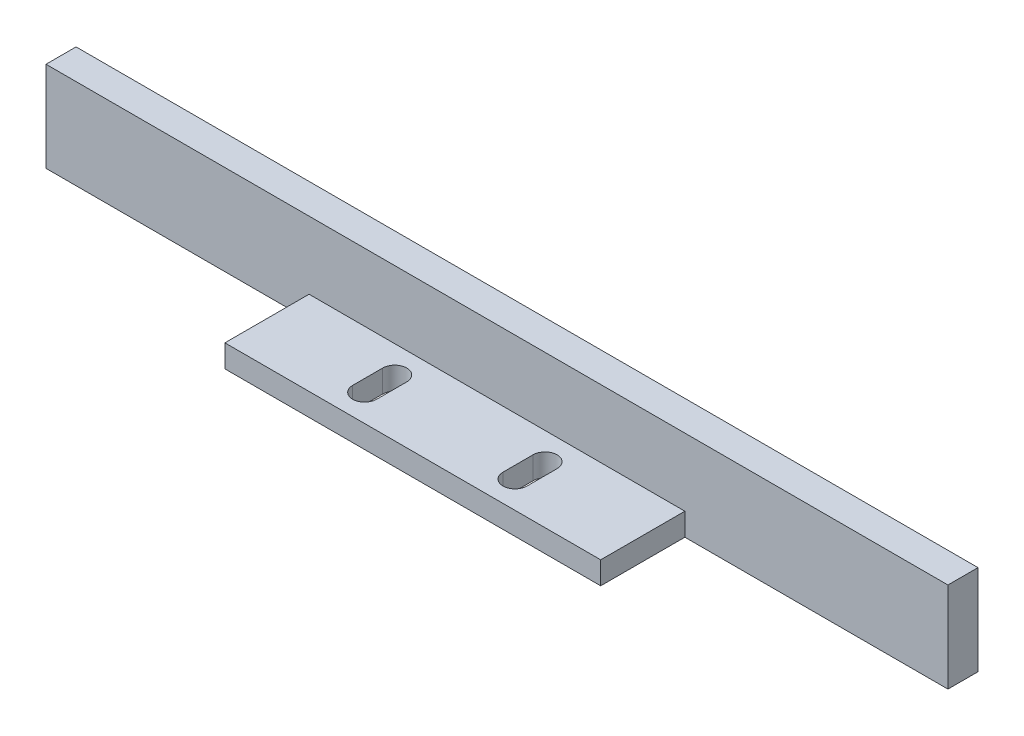
ISO-10303-21;
HEADER;
FILE_DESCRIPTION(('STEP AP214'),'2;1');
FILE_NAME('part.step','',(''),(''),'','','');
FILE_SCHEMA(('AUTOMOTIVE_DESIGN { 1 0 10303 214 1 1 1 1 }'));
ENDSEC;
DATA;
#1=APPLICATION_CONTEXT('core data for automotive mechanical design processes');
#2=APPLICATION_PROTOCOL_DEFINITION('international standard','automotive_design',2000,#1);
#3=PRODUCT_CONTEXT('',#1,'mechanical');
#4=PRODUCT('Part','Part','',(#3));
#5=PRODUCT_RELATED_PRODUCT_CATEGORY('part','',(#4));
#6=PRODUCT_DEFINITION_FORMATION('','',#4);
#7=PRODUCT_DEFINITION_CONTEXT('part definition',#1,'design');
#8=PRODUCT_DEFINITION('design','',#6,#7);
#9=PRODUCT_DEFINITION_SHAPE('','',#8);
#10=(LENGTH_UNIT() NAMED_UNIT(*) SI_UNIT(.MILLI.,.METRE.));
#11=(NAMED_UNIT(*) PLANE_ANGLE_UNIT() SI_UNIT($,.RADIAN.));
#12=(NAMED_UNIT(*) SI_UNIT($,.STERADIAN.) SOLID_ANGLE_UNIT());
#13=UNCERTAINTY_MEASURE_WITH_UNIT(LENGTH_MEASURE(1.E-05),#10,'distance_accuracy_value','');
#14=(GEOMETRIC_REPRESENTATION_CONTEXT(3) GLOBAL_UNCERTAINTY_ASSIGNED_CONTEXT((#13)) GLOBAL_UNIT_ASSIGNED_CONTEXT((#10,
#11,#12)) REPRESENTATION_CONTEXT('',''));
#15=CARTESIAN_POINT('',(0.,0.,0.));
#16=DIRECTION('',(0.,0.,1.));
#17=DIRECTION('',(1.,0.,0.));
#18=AXIS2_PLACEMENT_3D('',#15,#16,#17);
#19=CARTESIAN_POINT('',(-63.7673694913815,34.5965476746122,4.));
#20=DIRECTION('',(1.,0.,0.));
#21=DIRECTION('',(0.,0.,-1.));
#22=AXIS2_PLACEMENT_3D('',#19,#20,#21);
#23=PLANE('',#22);
#24=DIRECTION('',(0.,-1.,0.));
#25=VECTOR('',#24,1.);
#26=CARTESIAN_POINT('',(-63.7673694913815,34.5965476746122,0.));
#27=LINE('',#26,#25);
#28=CARTESIAN_POINT('',(-63.7673694913815,34.5965476746122,0.));
#29=VERTEX_POINT('',#28);
#30=CARTESIAN_POINT('',(-63.7673694913815,22.5965476746122,0.));
#31=VERTEX_POINT('',#30);
#32=EDGE_CURVE('E286',#29,#31,#27,.T.);
#33=ORIENTED_EDGE('',*,*,#32,.T.);
#34=DIRECTION('',(0.,0.,-1.));
#35=VECTOR('',#34,1.);
#36=CARTESIAN_POINT('',(-63.7673694913815,22.5965476746122,4.));
#37=LINE('',#36,#35);
#38=CARTESIAN_POINT('',(-63.7673694913815,22.5965476746122,4.));
#39=VERTEX_POINT('',#38);
#40=EDGE_CURVE('E11',#39,#31,#37,.T.);
#41=ORIENTED_EDGE('',*,*,#40,.F.);
#42=DIRECTION('',(0.,-1.,0.));
#43=VECTOR('',#42,1.);
#44=CARTESIAN_POINT('',(-63.7673694913815,34.5965476746122,4.));
#45=LINE('',#44,#43);
#46=CARTESIAN_POINT('',(-63.7673694913815,34.5965476746122,4.));
#47=VERTEX_POINT('',#46);
#48=EDGE_CURVE('E287',#47,#39,#45,.T.);
#49=ORIENTED_EDGE('',*,*,#48,.F.);
#50=DIRECTION('',(0.,0.,-1.));
#51=VECTOR('',#50,1.);
#52=CARTESIAN_POINT('',(-63.7673694913815,34.5965476746122,4.));
#53=LINE('',#52,#51);
#54=EDGE_CURVE('E302',#47,#29,#53,.T.);
#55=ORIENTED_EDGE('',*,*,#54,.T.);
#56=EDGE_LOOP('',(#33,#41,#49,#55));
#57=FACE_BOUND('',#56,.T.);
#58=ADVANCED_FACE('F39',(#57),#23,.F.);
#59=CARTESIAN_POINT('',(-63.7673694913815,22.5965476746122,4.));
#60=DIRECTION('',(0.,1.,0.));
#61=DIRECTION('',(0.,0.,1.));
#62=AXIS2_PLACEMENT_3D('',#59,#60,#61);
#63=PLANE('',#62);
#64=CARTESIAN_POINT('',(6.23263050861855,22.5965476746122,7.6));
#65=DIRECTION('',(0.,1.,0.));
#66=DIRECTION('',(-1.,0.,0.));
#67=AXIS2_PLACEMENT_3D('',#64,#65,#66);
#68=CIRCLE('',#67,1.6);
#69=CARTESIAN_POINT('',(7.83263050861855,22.5965476746122,7.6));
#70=VERTEX_POINT('',#69);
#71=CARTESIAN_POINT('',(4.63263050861855,22.5965476746122,7.6));
#72=VERTEX_POINT('',#71);
#73=EDGE_CURVE('E166',#70,#72,#68,.T.);
#74=ORIENTED_EDGE('',*,*,#73,.T.);
#75=DIRECTION('',(0.,0.,1.));
#76=VECTOR('',#75,1.);
#77=CARTESIAN_POINT('',(4.63263050861855,22.5965476746122,0.));
#78=LINE('',#77,#76);
#79=CARTESIAN_POINT('',(4.63263050861855,22.5965476746122,11.6));
#80=VERTEX_POINT('',#79);
#81=EDGE_CURVE('E157',#72,#80,#78,.T.);
#82=ORIENTED_EDGE('',*,*,#81,.T.);
#83=CARTESIAN_POINT('',(6.23263050861855,22.5965476746122,11.6));
#84=DIRECTION('',(0.,1.,0.));
#85=DIRECTION('',(-1.,0.,0.));
#86=AXIS2_PLACEMENT_3D('',#83,#84,#85);
#87=CIRCLE('',#86,1.6);
#88=CARTESIAN_POINT('',(7.83263050861855,22.5965476746122,11.6));
#89=VERTEX_POINT('',#88);
#90=EDGE_CURVE('E169',#80,#89,#87,.T.);
#91=ORIENTED_EDGE('',*,*,#90,.T.);
#92=DIRECTION('',(0.,0.,-1.));
#93=VECTOR('',#92,1.);
#94=CARTESIAN_POINT('',(7.83263050861855,22.5965476746122,0.));
#95=LINE('',#94,#93);
#96=EDGE_CURVE('E54',#89,#70,#95,.T.);
#97=ORIENTED_EDGE('',*,*,#96,.T.);
#98=EDGE_LOOP('',(#74,#82,#91,#97));
#99=FACE_BOUND('',#98,.T.);
#100=CARTESIAN_POINT('',(-13.7673694913815,22.5965476746122,7.6));
#101=DIRECTION('',(0.,1.,0.));
#102=DIRECTION('',(-1.,0.,0.));
#103=AXIS2_PLACEMENT_3D('',#100,#101,#102);
#104=CIRCLE('',#103,1.6);
#105=CARTESIAN_POINT('',(-12.1673694913815,22.5965476746122,7.6));
#106=VERTEX_POINT('',#105);
#107=CARTESIAN_POINT('',(-15.3673694913815,22.5965476746122,7.6));
#108=VERTEX_POINT('',#107);
#109=EDGE_CURVE('E219',#106,#108,#104,.T.);
#110=ORIENTED_EDGE('',*,*,#109,.T.);
#111=DIRECTION('',(0.,0.,1.));
#112=VECTOR('',#111,1.);
#113=CARTESIAN_POINT('',(-15.3673694913815,22.5965476746122,0.));
#114=LINE('',#113,#112);
#115=CARTESIAN_POINT('',(-15.3673694913815,22.5965476746122,11.6));
#116=VERTEX_POINT('',#115);
#117=EDGE_CURVE('E207',#108,#116,#114,.T.);
#118=ORIENTED_EDGE('',*,*,#117,.T.);
#119=CARTESIAN_POINT('',(-13.7673694913815,22.5965476746122,11.6));
#120=DIRECTION('',(0.,1.,0.));
#121=DIRECTION('',(-1.,0.,0.));
#122=AXIS2_PLACEMENT_3D('',#119,#120,#121);
#123=CIRCLE('',#122,1.6);
#124=CARTESIAN_POINT('',(-12.1673694913815,22.5965476746122,11.6));
#125=VERTEX_POINT('',#124);
#126=EDGE_CURVE('E211',#116,#125,#123,.T.);
#127=ORIENTED_EDGE('',*,*,#126,.T.);
#128=DIRECTION('',(0.,0.,1.));
#129=VECTOR('',#128,1.);
#130=CARTESIAN_POINT('',(-12.1673694913815,22.5965476746122,0.));
#131=LINE('',#130,#129);
#132=EDGE_CURVE('E216',#106,#125,#131,.T.);
#133=ORIENTED_EDGE('',*,*,#132,.F.);
#134=EDGE_LOOP('',(#110,#118,#127,#133));
#135=FACE_BOUND('',#134,.T.);
#136=DIRECTION('',(1.,0.,0.));
#137=VECTOR('',#136,1.);
#138=CARTESIAN_POINT('',(-63.7673694913815,22.5965476746122,0.));
#139=LINE('',#138,#137);
#140=CARTESIAN_POINT('',(56.2326305086185,22.5965476746122,0.));
#141=VERTEX_POINT('',#140);
#142=EDGE_CURVE('E306',#31,#141,#139,.T.);
#143=ORIENTED_EDGE('',*,*,#142,.T.);
#144=DIRECTION('',(0.,0.,-1.));
#145=VECTOR('',#144,1.);
#146=CARTESIAN_POINT('',(56.2326305086185,22.5965476746122,4.));
#147=LINE('',#146,#145);
#148=CARTESIAN_POINT('',(56.2326305086185,22.5965476746122,4.));
#149=VERTEX_POINT('',#148);
#150=EDGE_CURVE('E47',#149,#141,#147,.T.);
#151=ORIENTED_EDGE('',*,*,#150,.F.);
#152=DIRECTION('',(1.,0.,0.));
#153=VECTOR('',#152,1.);
#154=CARTESIAN_POINT('',(-63.7673694913815,22.5965476746122,4.));
#155=LINE('',#154,#153);
#156=CARTESIAN_POINT('',(21.2326305086185,22.5965476746122,4.));
#157=VERTEX_POINT('',#156);
#158=EDGE_CURVE('E291',#157,#149,#155,.T.);
#159=ORIENTED_EDGE('',*,*,#158,.F.);
#160=DIRECTION('',(0.,0.,-1.));
#161=VECTOR('',#160,1.);
#162=CARTESIAN_POINT('',(21.2326305086185,22.5965476746122,15.2));
#163=LINE('',#162,#161);
#164=CARTESIAN_POINT('',(21.2326305086185,22.5965476746122,15.2));
#165=VERTEX_POINT('',#164);
#166=EDGE_CURVE('E282',#165,#157,#163,.T.);
#167=ORIENTED_EDGE('',*,*,#166,.F.);
#168=DIRECTION('',(1.,0.,0.));
#169=VECTOR('',#168,1.);
#170=CARTESIAN_POINT('',(-28.7673694913815,22.5965476746122,15.2));
#171=LINE('',#170,#169);
#172=CARTESIAN_POINT('',(-28.7673694913815,22.5965476746122,15.2));
#173=VERTEX_POINT('',#172);
#174=EDGE_CURVE('E247',#173,#165,#171,.T.);
#175=ORIENTED_EDGE('',*,*,#174,.F.);
#176=DIRECTION('',(0.,0.,-1.));
#177=VECTOR('',#176,1.);
#178=CARTESIAN_POINT('',(-28.7673694913815,22.5965476746122,15.2));
#179=LINE('',#178,#177);
#180=CARTESIAN_POINT('',(-28.7673694913815,22.5965476746122,4.));
#181=VERTEX_POINT('',#180);
#182=EDGE_CURVE('E260',#173,#181,#179,.T.);
#183=ORIENTED_EDGE('',*,*,#182,.T.);
#184=EDGE_CURVE('E293',#39,#181,#155,.T.);
#185=ORIENTED_EDGE('',*,*,#184,.F.);
#186=ORIENTED_EDGE('',*,*,#40,.T.);
#187=EDGE_LOOP('',(#143,#151,#159,#167,#175,#183,#185,#186));
#188=FACE_BOUND('',#187,.T.);
#189=ADVANCED_FACE('F174',(#99,#135,#188),#63,.F.);
#190=CARTESIAN_POINT('',(56.2326305086185,34.5965476746122,4.));
#191=DIRECTION('',(-1.,0.,0.));
#192=DIRECTION('',(0.,-1.,0.));
#193=AXIS2_PLACEMENT_3D('',#190,#191,#192);
#194=PLANE('',#193);
#195=DIRECTION('',(0.,1.,0.));
#196=VECTOR('',#195,1.);
#197=CARTESIAN_POINT('',(56.2326305086185,34.5965476746122,0.));
#198=LINE('',#197,#196);
#199=CARTESIAN_POINT('',(56.2326305086185,34.5965476746122,0.));
#200=VERTEX_POINT('',#199);
#201=EDGE_CURVE('E309',#141,#200,#198,.T.);
#202=ORIENTED_EDGE('',*,*,#201,.T.);
#203=DIRECTION('',(0.,0.,-1.));
#204=VECTOR('',#203,1.);
#205=CARTESIAN_POINT('',(56.2326305086185,34.5965476746122,4.));
#206=LINE('',#205,#204);
#207=CARTESIAN_POINT('',(56.2326305086185,34.5965476746122,4.));
#208=VERTEX_POINT('',#207);
#209=EDGE_CURVE('E317',#208,#200,#206,.T.);
#210=ORIENTED_EDGE('',*,*,#209,.F.);
#211=DIRECTION('',(0.,1.,0.));
#212=VECTOR('',#211,1.);
#213=CARTESIAN_POINT('',(56.2326305086185,34.5965476746122,4.));
#214=LINE('',#213,#212);
#215=EDGE_CURVE('E296',#149,#208,#214,.T.);
#216=ORIENTED_EDGE('',*,*,#215,.F.);
#217=ORIENTED_EDGE('',*,*,#150,.T.);
#218=EDGE_LOOP('',(#202,#210,#216,#217));
#219=FACE_BOUND('',#218,.T.);
#220=ADVANCED_FACE('F326',(#219),#194,.F.);
#221=CARTESIAN_POINT('',(-63.7673694913815,34.5965476746122,4.));
#222=DIRECTION('',(0.,-1.,0.));
#223=DIRECTION('',(0.,0.,-1.));
#224=AXIS2_PLACEMENT_3D('',#221,#222,#223);
#225=PLANE('',#224);
#226=DIRECTION('',(-1.,0.,0.));
#227=VECTOR('',#226,1.);
#228=CARTESIAN_POINT('',(-63.7673694913815,34.5965476746122,0.));
#229=LINE('',#228,#227);
#230=EDGE_CURVE('E292',#200,#29,#229,.T.);
#231=ORIENTED_EDGE('',*,*,#230,.T.);
#232=ORIENTED_EDGE('',*,*,#54,.F.);
#233=DIRECTION('',(-1.,0.,0.));
#234=VECTOR('',#233,1.);
#235=CARTESIAN_POINT('',(-63.7673694913815,34.5965476746122,4.));
#236=LINE('',#235,#234);
#237=EDGE_CURVE('E299',#208,#47,#236,.T.);
#238=ORIENTED_EDGE('',*,*,#237,.F.);
#239=ORIENTED_EDGE('',*,*,#209,.T.);
#240=EDGE_LOOP('',(#231,#232,#238,#239));
#241=FACE_BOUND('',#240,.T.);
#242=ADVANCED_FACE('F336',(#241),#225,.F.);
#243=CARTESIAN_POINT('',(0.,0.,4.));
#244=DIRECTION('',(0.,0.,1.));
#245=DIRECTION('',(1.,0.,0.));
#246=AXIS2_PLACEMENT_3D('',#243,#244,#245);
#247=PLANE('',#246);
#248=DIRECTION('',(0.,-1.,0.));
#249=VECTOR('',#248,1.);
#250=CARTESIAN_POINT('',(-28.7673694913815,25.5965476746122,4.));
#251=LINE('',#250,#249);
#252=CARTESIAN_POINT('',(-28.7673694913815,25.5965476746122,4.));
#253=VERTEX_POINT('',#252);
#254=EDGE_CURVE('E251',#253,#181,#251,.T.);
#255=ORIENTED_EDGE('',*,*,#254,.F.);
#256=DIRECTION('',(-1.,0.,0.));
#257=VECTOR('',#256,1.);
#258=CARTESIAN_POINT('',(21.2326305086185,25.5965476746122,4.));
#259=LINE('',#258,#257);
#260=CARTESIAN_POINT('',(21.2326305086185,25.5965476746122,4.));
#261=VERTEX_POINT('',#260);
#262=EDGE_CURVE('E264',#261,#253,#259,.T.);
#263=ORIENTED_EDGE('',*,*,#262,.F.);
#264=DIRECTION('',(0.,1.,0.));
#265=VECTOR('',#264,1.);
#266=CARTESIAN_POINT('',(21.2326305086185,22.5965476746122,4.));
#267=LINE('',#266,#265);
#268=EDGE_CURVE('E201',#157,#261,#267,.T.);
#269=ORIENTED_EDGE('',*,*,#268,.F.);
#270=ORIENTED_EDGE('',*,*,#158,.T.);
#271=ORIENTED_EDGE('',*,*,#215,.T.);
#272=ORIENTED_EDGE('',*,*,#237,.T.);
#273=ORIENTED_EDGE('',*,*,#48,.T.);
#274=ORIENTED_EDGE('',*,*,#184,.T.);
#275=EDGE_LOOP('',(#255,#263,#269,#270,#271,#272,#273,#274));
#276=FACE_BOUND('',#275,.T.);
#277=ADVANCED_FACE('F342',(#276),#247,.T.);
#278=CARTESIAN_POINT('',(0.,0.,0.));
#279=DIRECTION('',(0.,0.,1.));
#280=DIRECTION('',(1.,0.,0.));
#281=AXIS2_PLACEMENT_3D('',#278,#279,#280);
#282=PLANE('',#281);
#283=ORIENTED_EDGE('',*,*,#32,.F.);
#284=ORIENTED_EDGE('',*,*,#230,.F.);
#285=ORIENTED_EDGE('',*,*,#201,.F.);
#286=ORIENTED_EDGE('',*,*,#142,.F.);
#287=EDGE_LOOP('',(#283,#284,#285,#286));
#288=FACE_BOUND('',#287,.T.);
#289=ADVANCED_FACE('F333',(#288),#282,.F.);
#290=CARTESIAN_POINT('',(21.2326305086185,22.5965476746122,15.2));
#291=DIRECTION('',(-1.,0.,0.));
#292=DIRECTION('',(0.,0.,1.));
#293=AXIS2_PLACEMENT_3D('',#290,#291,#292);
#294=PLANE('',#293);
#295=ORIENTED_EDGE('',*,*,#268,.T.);
#296=DIRECTION('',(0.,0.,-1.));
#297=VECTOR('',#296,1.);
#298=CARTESIAN_POINT('',(21.2326305086185,25.5965476746122,15.2));
#299=LINE('',#298,#297);
#300=CARTESIAN_POINT('',(21.2326305086185,25.5965476746122,15.2));
#301=VERTEX_POINT('',#300);
#302=EDGE_CURVE('E278',#301,#261,#299,.T.);
#303=ORIENTED_EDGE('',*,*,#302,.F.);
#304=DIRECTION('',(0.,1.,0.));
#305=VECTOR('',#304,1.);
#306=CARTESIAN_POINT('',(21.2326305086185,22.5965476746122,15.2));
#307=LINE('',#306,#305);
#308=EDGE_CURVE('E250',#165,#301,#307,.T.);
#309=ORIENTED_EDGE('',*,*,#308,.F.);
#310=ORIENTED_EDGE('',*,*,#166,.T.);
#311=EDGE_LOOP('',(#295,#303,#309,#310));
#312=FACE_BOUND('',#311,.T.);
#313=ADVANCED_FACE('F348',(#312),#294,.F.);
#314=CARTESIAN_POINT('',(21.2326305086185,25.5965476746122,15.2));
#315=DIRECTION('',(0.,-1.,0.));
#316=DIRECTION('',(1.,0.,0.));
#317=AXIS2_PLACEMENT_3D('',#314,#315,#316);
#318=PLANE('',#317);
#319=CARTESIAN_POINT('',(6.23263050861855,25.5965476746122,11.6));
#320=DIRECTION('',(0.,1.,0.));
#321=DIRECTION('',(-1.,0.,0.));
#322=AXIS2_PLACEMENT_3D('',#319,#320,#321);
#323=CIRCLE('',#322,1.6);
#324=CARTESIAN_POINT('',(4.63263050861855,25.5965476746122,11.6));
#325=VERTEX_POINT('',#324);
#326=CARTESIAN_POINT('',(7.83263050861855,25.5965476746122,11.6));
#327=VERTEX_POINT('',#326);
#328=EDGE_CURVE('E191',#325,#327,#323,.T.);
#329=ORIENTED_EDGE('',*,*,#328,.F.);
#330=DIRECTION('',(0.,0.,1.));
#331=VECTOR('',#330,1.);
#332=CARTESIAN_POINT('',(4.63263050861855,25.5965476746122,0.));
#333=LINE('',#332,#331);
#334=CARTESIAN_POINT('',(4.63263050861855,25.5965476746122,7.6));
#335=VERTEX_POINT('',#334);
#336=EDGE_CURVE('E160',#335,#325,#333,.T.);
#337=ORIENTED_EDGE('',*,*,#336,.F.);
#338=CARTESIAN_POINT('',(6.23263050861855,25.5965476746122,7.6));
#339=DIRECTION('',(0.,1.,0.));
#340=DIRECTION('',(-1.,0.,0.));
#341=AXIS2_PLACEMENT_3D('',#338,#339,#340);
#342=CIRCLE('',#341,1.6);
#343=CARTESIAN_POINT('',(7.83263050861855,25.5965476746122,7.6));
#344=VERTEX_POINT('',#343);
#345=EDGE_CURVE('E178',#344,#335,#342,.T.);
#346=ORIENTED_EDGE('',*,*,#345,.F.);
#347=DIRECTION('',(0.,0.,-1.));
#348=VECTOR('',#347,1.);
#349=CARTESIAN_POINT('',(7.83263050861855,25.5965476746122,0.));
#350=LINE('',#349,#348);
#351=EDGE_CURVE('E182',#327,#344,#350,.T.);
#352=ORIENTED_EDGE('',*,*,#351,.F.);
#353=EDGE_LOOP('',(#329,#337,#346,#352));
#354=FACE_BOUND('',#353,.T.);
#355=CARTESIAN_POINT('',(-13.7673694913815,25.5965476746122,11.6));
#356=DIRECTION('',(0.,1.,0.));
#357=DIRECTION('',(-1.,0.,0.));
#358=AXIS2_PLACEMENT_3D('',#355,#356,#357);
#359=CIRCLE('',#358,1.6);
#360=CARTESIAN_POINT('',(-15.3673694913815,25.5965476746122,11.6));
#361=VERTEX_POINT('',#360);
#362=CARTESIAN_POINT('',(-12.1673694913815,25.5965476746122,11.6));
#363=VERTEX_POINT('',#362);
#364=EDGE_CURVE('E227',#361,#363,#359,.T.);
#365=ORIENTED_EDGE('',*,*,#364,.F.);
#366=DIRECTION('',(0.,0.,1.));
#367=VECTOR('',#366,1.);
#368=CARTESIAN_POINT('',(-15.3673694913815,25.5965476746122,0.));
#369=LINE('',#368,#367);
#370=CARTESIAN_POINT('',(-15.3673694913815,25.5965476746122,7.6));
#371=VERTEX_POINT('',#370);
#372=EDGE_CURVE('E224',#371,#361,#369,.T.);
#373=ORIENTED_EDGE('',*,*,#372,.F.);
#374=CARTESIAN_POINT('',(-13.7673694913815,25.5965476746122,7.6));
#375=DIRECTION('',(0.,1.,0.));
#376=DIRECTION('',(-1.,0.,0.));
#377=AXIS2_PLACEMENT_3D('',#374,#375,#376);
#378=CIRCLE('',#377,1.6);
#379=CARTESIAN_POINT('',(-12.1673694913815,25.5965476746122,7.6));
#380=VERTEX_POINT('',#379);
#381=EDGE_CURVE('E212',#380,#371,#378,.T.);
#382=ORIENTED_EDGE('',*,*,#381,.F.);
#383=DIRECTION('',(0.,0.,1.));
#384=VECTOR('',#383,1.);
#385=CARTESIAN_POINT('',(-12.1673694913815,25.5965476746122,0.));
#386=LINE('',#385,#384);
#387=EDGE_CURVE('E230',#380,#363,#386,.T.);
#388=ORIENTED_EDGE('',*,*,#387,.T.);
#389=EDGE_LOOP('',(#365,#373,#382,#388));
#390=FACE_BOUND('',#389,.T.);
#391=ORIENTED_EDGE('',*,*,#262,.T.);
#392=DIRECTION('',(0.,0.,-1.));
#393=VECTOR('',#392,1.);
#394=CARTESIAN_POINT('',(-28.7673694913815,25.5965476746122,15.2));
#395=LINE('',#394,#393);
#396=CARTESIAN_POINT('',(-28.7673694913815,25.5965476746122,15.2));
#397=VERTEX_POINT('',#396);
#398=EDGE_CURVE('E274',#397,#253,#395,.T.);
#399=ORIENTED_EDGE('',*,*,#398,.F.);
#400=DIRECTION('',(-1.,0.,0.));
#401=VECTOR('',#400,1.);
#402=CARTESIAN_POINT('',(21.2326305086185,25.5965476746122,15.2));
#403=LINE('',#402,#401);
#404=EDGE_CURVE('E254',#301,#397,#403,.T.);
#405=ORIENTED_EDGE('',*,*,#404,.F.);
#406=ORIENTED_EDGE('',*,*,#302,.T.);
#407=EDGE_LOOP('',(#391,#399,#405,#406));
#408=FACE_BOUND('',#407,.T.);
#409=ADVANCED_FACE('F359',(#354,#390,#408),#318,.F.);
#410=CARTESIAN_POINT('',(-28.7673694913815,25.5965476746122,15.2));
#411=DIRECTION('',(1.,0.,0.));
#412=DIRECTION('',(0.,0.,-1.));
#413=AXIS2_PLACEMENT_3D('',#410,#411,#412);
#414=PLANE('',#413);
#415=ORIENTED_EDGE('',*,*,#254,.T.);
#416=ORIENTED_EDGE('',*,*,#182,.F.);
#417=DIRECTION('',(0.,-1.,0.));
#418=VECTOR('',#417,1.);
#419=CARTESIAN_POINT('',(-28.7673694913815,25.5965476746122,15.2));
#420=LINE('',#419,#418);
#421=EDGE_CURVE('E257',#397,#173,#420,.T.);
#422=ORIENTED_EDGE('',*,*,#421,.F.);
#423=ORIENTED_EDGE('',*,*,#398,.T.);
#424=EDGE_LOOP('',(#415,#416,#422,#423));
#425=FACE_BOUND('',#424,.T.);
#426=ADVANCED_FACE('F357',(#425),#414,.F.);
#427=CARTESIAN_POINT('',(0.,0.,15.2));
#428=DIRECTION('',(0.,0.,1.));
#429=DIRECTION('',(1.,0.,0.));
#430=AXIS2_PLACEMENT_3D('',#427,#428,#429);
#431=PLANE('',#430);
#432=ORIENTED_EDGE('',*,*,#174,.T.);
#433=ORIENTED_EDGE('',*,*,#308,.T.);
#434=ORIENTED_EDGE('',*,*,#404,.T.);
#435=ORIENTED_EDGE('',*,*,#421,.T.);
#436=EDGE_LOOP('',(#432,#433,#434,#435));
#437=FACE_BOUND('',#436,.T.);
#438=ADVANCED_FACE('F352',(#437),#431,.T.);
#439=CARTESIAN_POINT('',(-15.3673694913815,22.5965476746122,0.));
#440=DIRECTION('',(-1.,0.,0.));
#441=DIRECTION('',(0.,-1.,0.));
#442=AXIS2_PLACEMENT_3D('',#439,#440,#441);
#443=PLANE('',#442);
#444=ORIENTED_EDGE('',*,*,#372,.T.);
#445=DIRECTION('',(0.,1.,0.));
#446=VECTOR('',#445,1.);
#447=CARTESIAN_POINT('',(-15.3673694913815,22.5965476746122,11.6));
#448=LINE('',#447,#446);
#449=EDGE_CURVE('E223',#116,#361,#448,.T.);
#450=ORIENTED_EDGE('',*,*,#449,.F.);
#451=ORIENTED_EDGE('',*,*,#117,.F.);
#452=DIRECTION('',(0.,1.,0.));
#453=VECTOR('',#452,1.);
#454=CARTESIAN_POINT('',(-15.3673694913815,22.5965476746122,7.6));
#455=LINE('',#454,#453);
#456=EDGE_CURVE('E192',#108,#371,#455,.T.);
#457=ORIENTED_EDGE('',*,*,#456,.T.);
#458=EDGE_LOOP('',(#444,#450,#451,#457));
#459=FACE_BOUND('',#458,.T.);
#460=ADVANCED_FACE('F412',(#459),#443,.F.);
#461=CARTESIAN_POINT('',(-13.7673694913815,22.5965476746122,7.6));
#462=DIRECTION('',(0.,1.,0.));
#463=DIRECTION('',(-1.,0.,0.));
#464=AXIS2_PLACEMENT_3D('',#461,#462,#463);
#465=CYLINDRICAL_SURFACE('',#464,1.6);
#466=ORIENTED_EDGE('',*,*,#381,.T.);
#467=ORIENTED_EDGE('',*,*,#456,.F.);
#468=ORIENTED_EDGE('',*,*,#109,.F.);
#469=DIRECTION('',(0.,1.,0.));
#470=VECTOR('',#469,1.);
#471=CARTESIAN_POINT('',(-12.1673694913815,22.5965476746122,7.6));
#472=LINE('',#471,#470);
#473=EDGE_CURVE('E239',#106,#380,#472,.T.);
#474=ORIENTED_EDGE('',*,*,#473,.T.);
#475=EDGE_LOOP('',(#466,#467,#468,#474));
#476=FACE_BOUND('',#475,.T.);
#477=ADVANCED_FACE('F429',(#476),#465,.F.);
#478=CARTESIAN_POINT('',(-12.1673694913815,22.5965476746122,0.));
#479=DIRECTION('',(-1.,0.,0.));
#480=DIRECTION('',(0.,-1.,0.));
#481=AXIS2_PLACEMENT_3D('',#478,#479,#480);
#482=PLANE('',#481);
#483=ORIENTED_EDGE('',*,*,#387,.F.);
#484=ORIENTED_EDGE('',*,*,#473,.F.);
#485=ORIENTED_EDGE('',*,*,#132,.T.);
#486=DIRECTION('',(0.,1.,0.));
#487=VECTOR('',#486,1.);
#488=CARTESIAN_POINT('',(-12.1673694913815,22.5965476746122,11.6));
#489=LINE('',#488,#487);
#490=EDGE_CURVE('E62',#125,#363,#489,.T.);
#491=ORIENTED_EDGE('',*,*,#490,.T.);
#492=EDGE_LOOP('',(#483,#484,#485,#491));
#493=FACE_BOUND('',#492,.T.);
#494=ADVANCED_FACE('F439',(#493),#482,.T.);
#495=CARTESIAN_POINT('',(-13.7673694913815,22.5965476746122,11.6));
#496=DIRECTION('',(0.,1.,0.));
#497=DIRECTION('',(-1.,0.,0.));
#498=AXIS2_PLACEMENT_3D('',#495,#496,#497);
#499=CYLINDRICAL_SURFACE('',#498,1.6);
#500=ORIENTED_EDGE('',*,*,#364,.T.);
#501=ORIENTED_EDGE('',*,*,#490,.F.);
#502=ORIENTED_EDGE('',*,*,#126,.F.);
#503=ORIENTED_EDGE('',*,*,#449,.T.);
#504=EDGE_LOOP('',(#500,#501,#502,#503));
#505=FACE_BOUND('',#504,.T.);
#506=ADVANCED_FACE('F449',(#505),#499,.F.);
#507=CARTESIAN_POINT('',(4.63263050861855,22.5965476746122,0.));
#508=DIRECTION('',(-1.,0.,0.));
#509=DIRECTION('',(0.,-1.,0.));
#510=AXIS2_PLACEMENT_3D('',#507,#508,#509);
#511=PLANE('',#510);
#512=ORIENTED_EDGE('',*,*,#336,.T.);
#513=DIRECTION('',(0.,1.,0.));
#514=VECTOR('',#513,1.);
#515=CARTESIAN_POINT('',(4.63263050861855,22.5965476746122,11.6));
#516=LINE('',#515,#514);
#517=EDGE_CURVE('E153',#80,#325,#516,.T.);
#518=ORIENTED_EDGE('',*,*,#517,.F.);
#519=ORIENTED_EDGE('',*,*,#81,.F.);
#520=DIRECTION('',(0.,1.,0.));
#521=VECTOR('',#520,1.);
#522=CARTESIAN_POINT('',(4.63263050861855,22.5965476746122,7.6));
#523=LINE('',#522,#521);
#524=EDGE_CURVE('E198',#72,#335,#523,.T.);
#525=ORIENTED_EDGE('',*,*,#524,.T.);
#526=EDGE_LOOP('',(#512,#518,#519,#525));
#527=FACE_BOUND('',#526,.T.);
#528=ADVANCED_FACE('F155',(#527),#511,.F.);
#529=CARTESIAN_POINT('',(6.23263050861855,22.5965476746122,7.6));
#530=DIRECTION('',(0.,1.,0.));
#531=DIRECTION('',(-1.,0.,0.));
#532=AXIS2_PLACEMENT_3D('',#529,#530,#531);
#533=CYLINDRICAL_SURFACE('',#532,1.6);
#534=ORIENTED_EDGE('',*,*,#345,.T.);
#535=ORIENTED_EDGE('',*,*,#524,.F.);
#536=ORIENTED_EDGE('',*,*,#73,.F.);
#537=DIRECTION('',(0.,1.,0.));
#538=VECTOR('',#537,1.);
#539=CARTESIAN_POINT('',(7.83263050861855,22.5965476746122,7.6));
#540=LINE('',#539,#538);
#541=EDGE_CURVE('E202',#70,#344,#540,.T.);
#542=ORIENTED_EDGE('',*,*,#541,.T.);
#543=EDGE_LOOP('',(#534,#535,#536,#542));
#544=FACE_BOUND('',#543,.T.);
#545=ADVANCED_FACE('F467',(#544),#533,.F.);
#546=CARTESIAN_POINT('',(7.83263050861855,22.5965476746122,0.));
#547=DIRECTION('',(1.,0.,0.));
#548=DIRECTION('',(0.,0.,-1.));
#549=AXIS2_PLACEMENT_3D('',#546,#547,#548);
#550=PLANE('',#549);
#551=ORIENTED_EDGE('',*,*,#351,.T.);
#552=ORIENTED_EDGE('',*,*,#541,.F.);
#553=ORIENTED_EDGE('',*,*,#96,.F.);
#554=DIRECTION('',(0.,1.,0.));
#555=VECTOR('',#554,1.);
#556=CARTESIAN_POINT('',(7.83263050861855,22.5965476746122,11.6));
#557=LINE('',#556,#555);
#558=EDGE_CURVE('E165',#89,#327,#557,.T.);
#559=ORIENTED_EDGE('',*,*,#558,.T.);
#560=EDGE_LOOP('',(#551,#552,#553,#559));
#561=FACE_BOUND('',#560,.T.);
#562=ADVANCED_FACE('F476',(#561),#550,.F.);
#563=CARTESIAN_POINT('',(6.23263050861855,22.5965476746122,11.6));
#564=DIRECTION('',(0.,1.,0.));
#565=DIRECTION('',(-1.,0.,0.));
#566=AXIS2_PLACEMENT_3D('',#563,#564,#565);
#567=CYLINDRICAL_SURFACE('',#566,1.6);
#568=ORIENTED_EDGE('',*,*,#328,.T.);
#569=ORIENTED_EDGE('',*,*,#558,.F.);
#570=ORIENTED_EDGE('',*,*,#90,.F.);
#571=ORIENTED_EDGE('',*,*,#517,.T.);
#572=EDGE_LOOP('',(#568,#569,#570,#571));
#573=FACE_BOUND('',#572,.T.);
#574=ADVANCED_FACE('F170',(#573),#567,.F.);
#575=CLOSED_SHELL('',(#58,#189,#220,#242,#277,#289,#313,#409,#426,#438,#460,#477,#494,#506,#528,
#545,#562,#574));
#576=MANIFOLD_SOLID_BREP('B2',#575);
#577=ADVANCED_BREP_SHAPE_REPRESENTATION('',(#18,#576),#14);
#578=SHAPE_DEFINITION_REPRESENTATION(#9,#577);
ENDSEC;
END-ISO-10303-21;
